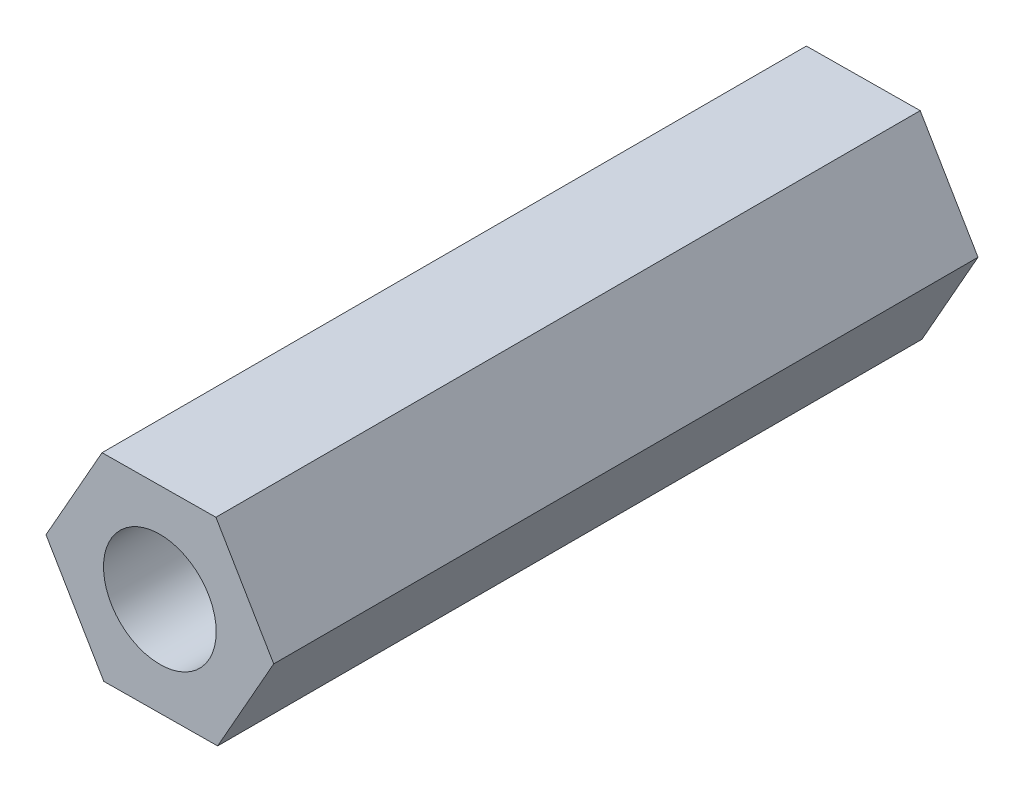
ISO-10303-21;
HEADER;
FILE_DESCRIPTION(('STEP AP214'),'2;1');
FILE_NAME('part.step','',(''),(''),'','','');
FILE_SCHEMA(('AUTOMOTIVE_DESIGN { 1 0 10303 214 1 1 1 1 }'));
ENDSEC;
DATA;
#1=APPLICATION_CONTEXT('core data for automotive mechanical design processes');
#2=APPLICATION_PROTOCOL_DEFINITION('international standard','automotive_design',2000,#1);
#3=PRODUCT_CONTEXT('',#1,'mechanical');
#4=PRODUCT('Part','Part','',(#3));
#5=PRODUCT_RELATED_PRODUCT_CATEGORY('part','',(#4));
#6=PRODUCT_DEFINITION_FORMATION('','',#4);
#7=PRODUCT_DEFINITION_CONTEXT('part definition',#1,'design');
#8=PRODUCT_DEFINITION('design','',#6,#7);
#9=PRODUCT_DEFINITION_SHAPE('','',#8);
#10=(LENGTH_UNIT() NAMED_UNIT(*) SI_UNIT(.MILLI.,.METRE.));
#11=(NAMED_UNIT(*) PLANE_ANGLE_UNIT() SI_UNIT($,.RADIAN.));
#12=(NAMED_UNIT(*) SI_UNIT($,.STERADIAN.) SOLID_ANGLE_UNIT());
#13=UNCERTAINTY_MEASURE_WITH_UNIT(LENGTH_MEASURE(1.E-05),#10,'distance_accuracy_value','');
#14=(GEOMETRIC_REPRESENTATION_CONTEXT(3) GLOBAL_UNCERTAINTY_ASSIGNED_CONTEXT((#13)) GLOBAL_UNIT_ASSIGNED_CONTEXT((#10,
#11,#12)) REPRESENTATION_CONTEXT('',''));
#15=CARTESIAN_POINT('',(0.,0.,0.));
#16=DIRECTION('',(0.,0.,1.));
#17=DIRECTION('',(1.,0.,0.));
#18=AXIS2_PLACEMENT_3D('',#15,#16,#17);
#19=CARTESIAN_POINT('',(0.,0.,25.));
#20=DIRECTION('',(0.,0.,1.));
#21=DIRECTION('',(1.,0.,0.));
#22=AXIS2_PLACEMENT_3D('',#19,#20,#21);
#23=PLANE('',#22);
#24=DIRECTION('',(0.999961257640527,0.00880245522430722,0.));
#25=VECTOR('',#24,1.);
#26=CARTESIAN_POINT('',(-1.98983906118775,-3.51765175136834,25.));
#27=LINE('',#26,#25);
#28=CARTESIAN_POINT('',(-1.98983906118775,-3.51765175136834,25.));
#29=VERTEX_POINT('',#28);
#30=CARTESIAN_POINT('',(2.05145624775792,-3.48207705211536,25.));
#31=VERTEX_POINT('',#30);
#32=EDGE_CURVE('E131',#29,#31,#27,.T.);
#33=ORIENTED_EDGE('',*,*,#32,.T.);
#34=DIRECTION('',(0.492357478980338,0.870393079529086,0.));
#35=VECTOR('',#34,1.);
#36=CARTESIAN_POINT('',(2.05145624775792,-3.48207705211536,25.));
#37=LINE('',#36,#35);
#38=CARTESIAN_POINT('',(4.04129530894568,0.0355746992529791,25.));
#39=VERTEX_POINT('',#38);
#40=EDGE_CURVE('E89',#31,#39,#37,.T.);
#41=ORIENTED_EDGE('',*,*,#40,.T.);
#42=DIRECTION('',(-0.507603778660189,0.861590624304779,0.));
#43=VECTOR('',#42,1.);
#44=CARTESIAN_POINT('',(4.04129530894568,0.0355746992529791,25.));
#45=LINE('',#44,#43);
#46=CARTESIAN_POINT('',(1.98983906118776,3.51765175136834,25.));
#47=VERTEX_POINT('',#46);
#48=EDGE_CURVE('E102',#39,#47,#45,.T.);
#49=ORIENTED_EDGE('',*,*,#48,.T.);
#50=DIRECTION('',(-0.999961257640527,-0.00880245522430723,0.));
#51=VECTOR('',#50,1.);
#52=CARTESIAN_POINT('',(1.98983906118776,3.51765175136834,25.));
#53=LINE('',#52,#51);
#54=CARTESIAN_POINT('',(-2.05145624775791,3.48207705211536,25.));
#55=VERTEX_POINT('',#54);
#56=EDGE_CURVE('E96',#47,#55,#53,.T.);
#57=ORIENTED_EDGE('',*,*,#56,.T.);
#58=DIRECTION('',(-0.492357478980338,-0.870393079529086,0.));
#59=VECTOR('',#58,1.);
#60=CARTESIAN_POINT('',(-2.05145624775791,3.48207705211536,25.));
#61=LINE('',#60,#59);
#62=CARTESIAN_POINT('',(-4.04129530894568,-0.0355746992529825,25.));
#63=VERTEX_POINT('',#62);
#64=EDGE_CURVE('E100',#55,#63,#61,.T.);
#65=ORIENTED_EDGE('',*,*,#64,.T.);
#66=DIRECTION('',(0.507603778660189,-0.861590624304779,0.));
#67=VECTOR('',#66,1.);
#68=CARTESIAN_POINT('',(-4.04129530894568,-0.0355746992529825,25.));
#69=LINE('',#68,#67);
#70=EDGE_CURVE('E52',#63,#29,#69,.T.);
#71=ORIENTED_EDGE('',*,*,#70,.T.);
#72=EDGE_LOOP('',(#33,#41,#49,#57,#65,#71));
#73=FACE_BOUND('',#72,.T.);
#74=CARTESIAN_POINT('',(0.,0.,25.));
#75=DIRECTION('',(0.,0.,1.));
#76=DIRECTION('',(1.,0.,0.));
#77=AXIS2_PLACEMENT_3D('',#74,#75,#76);
#78=CIRCLE('',#77,2.);
#79=CARTESIAN_POINT('',(2.,0.,25.));
#80=VERTEX_POINT('',#79);
#81=EDGE_CURVE('E124',#80,#80,#78,.T.);
#82=ORIENTED_EDGE('',*,*,#81,.F.);
#83=EDGE_LOOP('',(#82));
#84=FACE_BOUND('',#83,.T.);
#85=ADVANCED_FACE('F35',(#73,#84),#23,.T.);
#86=CARTESIAN_POINT('',(0.,0.,0.));
#87=DIRECTION('',(0.,0.,1.));
#88=DIRECTION('',(1.,0.,0.));
#89=AXIS2_PLACEMENT_3D('',#86,#87,#88);
#90=PLANE('',#89);
#91=DIRECTION('',(0.999961257640527,0.00880245522430722,0.));
#92=VECTOR('',#91,1.);
#93=CARTESIAN_POINT('',(-1.98983906118775,-3.51765175136834,0.));
#94=LINE('',#93,#92);
#95=CARTESIAN_POINT('',(-1.98983906118775,-3.51765175136834,0.));
#96=VERTEX_POINT('',#95);
#97=CARTESIAN_POINT('',(2.05145624775792,-3.48207705211536,0.));
#98=VERTEX_POINT('',#97);
#99=EDGE_CURVE('E120',#96,#98,#94,.T.);
#100=ORIENTED_EDGE('',*,*,#99,.F.);
#101=DIRECTION('',(0.507603778660189,-0.861590624304779,0.));
#102=VECTOR('',#101,1.);
#103=CARTESIAN_POINT('',(-4.04129530894568,-0.0355746992529825,0.));
#104=LINE('',#103,#102);
#105=CARTESIAN_POINT('',(-4.04129530894568,-0.0355746992529825,0.));
#106=VERTEX_POINT('',#105);
#107=EDGE_CURVE('E81',#106,#96,#104,.T.);
#108=ORIENTED_EDGE('',*,*,#107,.F.);
#109=DIRECTION('',(-0.492357478980338,-0.870393079529086,0.));
#110=VECTOR('',#109,1.);
#111=CARTESIAN_POINT('',(-2.05145624775791,3.48207705211536,0.));
#112=LINE('',#111,#110);
#113=CARTESIAN_POINT('',(-2.05145624775791,3.48207705211536,0.));
#114=VERTEX_POINT('',#113);
#115=EDGE_CURVE('E75',#114,#106,#112,.T.);
#116=ORIENTED_EDGE('',*,*,#115,.F.);
#117=DIRECTION('',(-0.999961257640527,-0.00880245522430723,0.));
#118=VECTOR('',#117,1.);
#119=CARTESIAN_POINT('',(1.98983906118776,3.51765175136834,0.));
#120=LINE('',#119,#118);
#121=CARTESIAN_POINT('',(1.98983906118776,3.51765175136834,0.));
#122=VERTEX_POINT('',#121);
#123=EDGE_CURVE('E110',#122,#114,#120,.T.);
#124=ORIENTED_EDGE('',*,*,#123,.F.);
#125=DIRECTION('',(-0.507603778660189,0.861590624304779,0.));
#126=VECTOR('',#125,1.);
#127=CARTESIAN_POINT('',(4.04129530894568,0.0355746992529791,0.));
#128=LINE('',#127,#126);
#129=CARTESIAN_POINT('',(4.04129530894568,0.0355746992529791,0.));
#130=VERTEX_POINT('',#129);
#131=EDGE_CURVE('E126',#130,#122,#128,.T.);
#132=ORIENTED_EDGE('',*,*,#131,.F.);
#133=DIRECTION('',(0.492357478980338,0.870393079529086,0.));
#134=VECTOR('',#133,1.);
#135=CARTESIAN_POINT('',(2.05145624775792,-3.48207705211536,0.));
#136=LINE('',#135,#134);
#137=EDGE_CURVE('E123',#98,#130,#136,.T.);
#138=ORIENTED_EDGE('',*,*,#137,.F.);
#139=EDGE_LOOP('',(#100,#108,#116,#124,#132,#138));
#140=FACE_BOUND('',#139,.T.);
#141=CARTESIAN_POINT('',(0.,0.,0.));
#142=DIRECTION('',(0.,0.,1.));
#143=DIRECTION('',(1.,0.,0.));
#144=AXIS2_PLACEMENT_3D('',#141,#142,#143);
#145=CIRCLE('',#144,2.);
#146=CARTESIAN_POINT('',(2.,0.,0.));
#147=VERTEX_POINT('',#146);
#148=EDGE_CURVE('E224',#147,#147,#145,.T.);
#149=ORIENTED_EDGE('',*,*,#148,.T.);
#150=EDGE_LOOP('',(#149));
#151=FACE_BOUND('',#150,.T.);
#152=ADVANCED_FACE('F140',(#140,#151),#90,.F.);
#153=CARTESIAN_POINT('',(-1.98983906118775,-3.51765175136834,25.));
#154=DIRECTION('',(-0.00880245522430722,0.999961257640527,0.));
#155=DIRECTION('',(-0.999961257640527,-0.00880245522430722,0.));
#156=AXIS2_PLACEMENT_3D('',#153,#154,#155);
#157=PLANE('',#156);
#158=ORIENTED_EDGE('',*,*,#99,.T.);
#159=DIRECTION('',(0.,0.,-1.));
#160=VECTOR('',#159,1.);
#161=CARTESIAN_POINT('',(2.05145624775792,-3.48207705211536,25.));
#162=LINE('',#161,#160);
#163=EDGE_CURVE('E11',#31,#98,#162,.T.);
#164=ORIENTED_EDGE('',*,*,#163,.F.);
#165=ORIENTED_EDGE('',*,*,#32,.F.);
#166=DIRECTION('',(0.,0.,-1.));
#167=VECTOR('',#166,1.);
#168=CARTESIAN_POINT('',(-1.98983906118775,-3.51765175136834,25.));
#169=LINE('',#168,#167);
#170=EDGE_CURVE('E116',#29,#96,#169,.T.);
#171=ORIENTED_EDGE('',*,*,#170,.T.);
#172=EDGE_LOOP('',(#158,#164,#165,#171));
#173=FACE_BOUND('',#172,.T.);
#174=ADVANCED_FACE('F37',(#173),#157,.F.);
#175=CARTESIAN_POINT('',(2.05145624775792,-3.48207705211536,25.));
#176=DIRECTION('',(-0.870393079529086,0.492357478980338,0.));
#177=DIRECTION('',(-0.492357478980338,-0.870393079529086,0.));
#178=AXIS2_PLACEMENT_3D('',#175,#176,#177);
#179=PLANE('',#178);
#180=ORIENTED_EDGE('',*,*,#137,.T.);
#181=DIRECTION('',(0.,0.,-1.));
#182=VECTOR('',#181,1.);
#183=CARTESIAN_POINT('',(4.04129530894568,0.0355746992529791,25.));
#184=LINE('',#183,#182);
#185=EDGE_CURVE('E44',#39,#130,#184,.T.);
#186=ORIENTED_EDGE('',*,*,#185,.F.);
#187=ORIENTED_EDGE('',*,*,#40,.F.);
#188=ORIENTED_EDGE('',*,*,#163,.T.);
#189=EDGE_LOOP('',(#180,#186,#187,#188));
#190=FACE_BOUND('',#189,.T.);
#191=ADVANCED_FACE('F165',(#190),#179,.F.);
#192=CARTESIAN_POINT('',(4.04129530894568,0.0355746992529791,25.));
#193=DIRECTION('',(-0.861590624304779,-0.507603778660189,0.));
#194=DIRECTION('',(0.507603778660189,-0.861590624304779,0.));
#195=AXIS2_PLACEMENT_3D('',#192,#193,#194);
#196=PLANE('',#195);
#197=ORIENTED_EDGE('',*,*,#131,.T.);
#198=DIRECTION('',(0.,0.,-1.));
#199=VECTOR('',#198,1.);
#200=CARTESIAN_POINT('',(1.98983906118776,3.51765175136834,25.));
#201=LINE('',#200,#199);
#202=EDGE_CURVE('E111',#47,#122,#201,.T.);
#203=ORIENTED_EDGE('',*,*,#202,.F.);
#204=ORIENTED_EDGE('',*,*,#48,.F.);
#205=ORIENTED_EDGE('',*,*,#185,.T.);
#206=EDGE_LOOP('',(#197,#203,#204,#205));
#207=FACE_BOUND('',#206,.T.);
#208=ADVANCED_FACE('F137',(#207),#196,.F.);
#209=CARTESIAN_POINT('',(1.98983906118776,3.51765175136834,25.));
#210=DIRECTION('',(0.00880245522430723,-0.999961257640527,0.));
#211=DIRECTION('',(0.999961257640527,0.00880245522430723,0.));
#212=AXIS2_PLACEMENT_3D('',#209,#210,#211);
#213=PLANE('',#212);
#214=ORIENTED_EDGE('',*,*,#123,.T.);
#215=DIRECTION('',(0.,0.,-1.));
#216=VECTOR('',#215,1.);
#217=CARTESIAN_POINT('',(-2.05145624775791,3.48207705211536,25.));
#218=LINE('',#217,#216);
#219=EDGE_CURVE('E107',#55,#114,#218,.T.);
#220=ORIENTED_EDGE('',*,*,#219,.F.);
#221=ORIENTED_EDGE('',*,*,#56,.F.);
#222=ORIENTED_EDGE('',*,*,#202,.T.);
#223=EDGE_LOOP('',(#214,#220,#221,#222));
#224=FACE_BOUND('',#223,.T.);
#225=ADVANCED_FACE('F108',(#224),#213,.F.);
#226=CARTESIAN_POINT('',(-2.05145624775791,3.48207705211536,25.));
#227=DIRECTION('',(0.870393079529086,-0.492357478980338,0.));
#228=DIRECTION('',(0.492357478980338,0.870393079529086,0.));
#229=AXIS2_PLACEMENT_3D('',#226,#227,#228);
#230=PLANE('',#229);
#231=ORIENTED_EDGE('',*,*,#115,.T.);
#232=DIRECTION('',(0.,0.,-1.));
#233=VECTOR('',#232,1.);
#234=CARTESIAN_POINT('',(-4.04129530894568,-0.0355746992529825,25.));
#235=LINE('',#234,#233);
#236=EDGE_CURVE('E112',#63,#106,#235,.T.);
#237=ORIENTED_EDGE('',*,*,#236,.F.);
#238=ORIENTED_EDGE('',*,*,#64,.F.);
#239=ORIENTED_EDGE('',*,*,#219,.T.);
#240=EDGE_LOOP('',(#231,#237,#238,#239));
#241=FACE_BOUND('',#240,.T.);
#242=ADVANCED_FACE('F114',(#241),#230,.F.);
#243=CARTESIAN_POINT('',(-4.04129530894568,-0.0355746992529825,25.));
#244=DIRECTION('',(0.861590624304779,0.507603778660189,0.));
#245=DIRECTION('',(-0.507603778660189,0.861590624304779,0.));
#246=AXIS2_PLACEMENT_3D('',#243,#244,#245);
#247=PLANE('',#246);
#248=ORIENTED_EDGE('',*,*,#107,.T.);
#249=ORIENTED_EDGE('',*,*,#170,.F.);
#250=ORIENTED_EDGE('',*,*,#70,.F.);
#251=ORIENTED_EDGE('',*,*,#236,.T.);
#252=EDGE_LOOP('',(#248,#249,#250,#251));
#253=FACE_BOUND('',#252,.T.);
#254=ADVANCED_FACE('F145',(#253),#247,.F.);
#255=CARTESIAN_POINT('',(0.,0.,25.));
#256=DIRECTION('',(0.,0.,-1.));
#257=DIRECTION('',(-1.,0.,0.));
#258=AXIS2_PLACEMENT_3D('',#255,#256,#257);
#259=CYLINDRICAL_SURFACE('',#258,2.);
#260=ORIENTED_EDGE('',*,*,#81,.T.);
#261=EDGE_LOOP('',(#260));
#262=FACE_BOUND('',#261,.T.);
#263=ORIENTED_EDGE('',*,*,#148,.F.);
#264=EDGE_LOOP('',(#263));
#265=FACE_BOUND('',#264,.T.);
#266=ADVANCED_FACE('F147',(#262,#265),#259,.F.);
#267=CLOSED_SHELL('',(#85,#152,#174,#191,#208,#225,#242,#254,#266));
#268=MANIFOLD_SOLID_BREP('B2',#267);
#269=ADVANCED_BREP_SHAPE_REPRESENTATION('',(#18,#268),#14);
#270=SHAPE_DEFINITION_REPRESENTATION(#9,#269);
ENDSEC;
END-ISO-10303-21;
